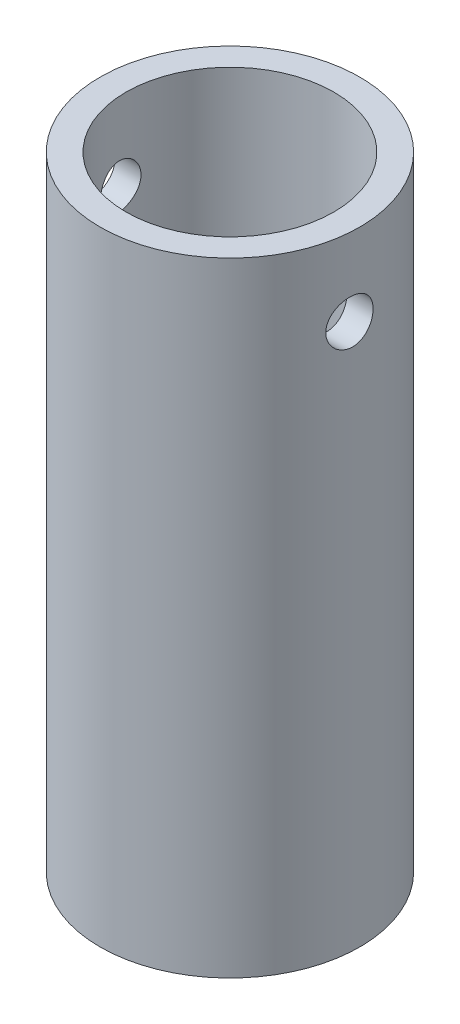
ISO-10303-21;
HEADER;
FILE_DESCRIPTION(('STEP AP214'),'2;1');
FILE_NAME('part.step','',(''),(''),'','','');
FILE_SCHEMA(('AUTOMOTIVE_DESIGN { 1 0 10303 214 1 1 1 1 }'));
ENDSEC;
DATA;
#1=APPLICATION_CONTEXT('core data for automotive mechanical design processes');
#2=APPLICATION_PROTOCOL_DEFINITION('international standard','automotive_design',2000,#1);
#3=PRODUCT_CONTEXT('',#1,'mechanical');
#4=PRODUCT('Part','Part','',(#3));
#5=PRODUCT_RELATED_PRODUCT_CATEGORY('part','',(#4));
#6=PRODUCT_DEFINITION_FORMATION('','',#4);
#7=PRODUCT_DEFINITION_CONTEXT('part definition',#1,'design');
#8=PRODUCT_DEFINITION('design','',#6,#7);
#9=PRODUCT_DEFINITION_SHAPE('','',#8);
#10=(LENGTH_UNIT() NAMED_UNIT(*) SI_UNIT(.MILLI.,.METRE.));
#11=(NAMED_UNIT(*) PLANE_ANGLE_UNIT() SI_UNIT($,.RADIAN.));
#12=(NAMED_UNIT(*) SI_UNIT($,.STERADIAN.) SOLID_ANGLE_UNIT());
#13=UNCERTAINTY_MEASURE_WITH_UNIT(LENGTH_MEASURE(1.E-05),#10,'distance_accuracy_value','');
#14=(GEOMETRIC_REPRESENTATION_CONTEXT(3) GLOBAL_UNCERTAINTY_ASSIGNED_CONTEXT((#13)) GLOBAL_UNIT_ASSIGNED_CONTEXT((#10,
#11,#12)) REPRESENTATION_CONTEXT('',''));
#15=CARTESIAN_POINT('',(0.,0.,0.));
#16=DIRECTION('',(0.,0.,1.));
#17=DIRECTION('',(1.,0.,0.));
#18=AXIS2_PLACEMENT_3D('',#15,#16,#17);
#19=CARTESIAN_POINT('',(0.,38.1,0.));
#20=DIRECTION('',(0.,-1.,0.));
#21=DIRECTION('',(0.,0.,-1.));
#22=AXIS2_PLACEMENT_3D('',#19,#20,#21);
#23=CYLINDRICAL_SURFACE('',#22,7.9375);
#24=CARTESIAN_POINT('',(-7.9375,32.0620434446328,0.));
#25=CARTESIAN_POINT('',(-7.93749916854388,32.0901690046642,-0.0707332037721569));
#26=CARTESIAN_POINT('',(-7.93654628277457,32.1242675503956,-0.139136621308723));
#27=CARTESIAN_POINT('',(-7.93319893250026,32.2034362462289,-0.269289439766741));
#28=CARTESIAN_POINT('',(-7.93080304727269,32.2485171830932,-0.331032212136444));
#29=CARTESIAN_POINT('',(-7.9251667454116,32.3483180944583,-0.446043671701426));
#30=CARTESIAN_POINT('',(-7.9219269308447,32.4030311883096,-0.499318356652004));
#31=CARTESIAN_POINT('',(-7.9152445116897,32.520574277642,-0.595955900179821));
#32=CARTESIAN_POINT('',(-7.91180194269821,32.5834028506257,-0.639320492137896));
#33=CARTESIAN_POINT('',(-7.90531169085098,32.7157679459917,-0.715131941817842));
#34=CARTESIAN_POINT('',(-7.90226603240692,32.7853359256277,-0.74752408116307));
#35=CARTESIAN_POINT('',(-7.89710994552861,32.9289584499102,-0.800165719723793));
#36=CARTESIAN_POINT('',(-7.89499951661862,33.0030129922744,-0.820415225116046));
#37=CARTESIAN_POINT('',(-7.89206943678914,33.1532942300001,-0.848140691763512));
#38=CARTESIAN_POINT('',(-7.89124630673045,33.2295145017414,-0.855651087250744));
#39=CARTESIAN_POINT('',(-7.89101498438398,33.3821359215772,-0.857782176846265));
#40=CARTESIAN_POINT('',(-7.89160675621756,33.4585370650361,-0.852403197799189));
#41=CARTESIAN_POINT('',(-7.89410254448084,33.6090047957604,-0.828967344277877));
#42=CARTESIAN_POINT('',(-7.89600085702248,33.6830800728933,-0.810965570005695));
#43=CARTESIAN_POINT('',(-7.90079252410001,33.8271590418172,-0.762865387311947));
#44=CARTESIAN_POINT('',(-7.90368590853065,33.8971626112089,-0.732766615457998));
#45=CARTESIAN_POINT('',(-7.90999418794165,34.0313815961485,-0.661201383560169));
#46=CARTESIAN_POINT('',(-7.91341085334088,34.0955761387393,-0.619695937608531));
#47=CARTESIAN_POINT('',(-7.92015498560724,34.2161182436795,-0.526522988831815));
#48=CARTESIAN_POINT('',(-7.92348244964828,34.2724655576486,-0.474855164471954));
#49=CARTESIAN_POINT('',(-7.9294143733758,34.3759344273578,-0.362573824867322));
#50=CARTESIAN_POINT('',(-7.93201599216555,34.4230195253824,-0.301926543126087));
#51=CARTESIAN_POINT('',(-7.93586191801818,34.5063374892884,-0.173547568578752));
#52=CARTESIAN_POINT('',(-7.9371062926291,34.5425708951772,-0.105816228519581));
#53=CARTESIAN_POINT('',(-7.93773287547375,34.6029462601578,0.034355536150099));
#54=CARTESIAN_POINT('',(-7.93712641154366,34.6271607229605,0.106764670328491));
#55=CARTESIAN_POINT('',(-7.93376101478138,34.663135702862,0.254562469789466));
#56=CARTESIAN_POINT('',(-7.93100222247633,34.674897032917,0.329950940243872));
#57=CARTESIAN_POINT('',(-7.92327680975247,34.6856229527401,0.480889213758865));
#58=CARTESIAN_POINT('',(-7.91832858979807,34.6846923045515,0.556432555874925));
#59=CARTESIAN_POINT('',(-7.90638232781787,34.6703868447929,0.706163727221364));
#60=CARTESIAN_POINT('',(-7.89938422290508,34.6570116514179,0.78035151479144));
#61=CARTESIAN_POINT('',(-7.88367118860505,34.6181609437016,0.925751380065584));
#62=CARTESIAN_POINT('',(-7.87494668541738,34.5926167806455,0.996944050210173));
#63=CARTESIAN_POINT('',(-7.85638141737859,34.5301701299191,1.13400435937443));
#64=CARTESIAN_POINT('',(-7.84654052423909,34.4932663360363,1.19987138491264));
#65=CARTESIAN_POINT('',(-7.82628257821505,34.4083839461822,1.32564685148368));
#66=CARTESIAN_POINT('',(-7.81585848552863,34.3602240706286,1.38543188100612));
#67=CARTESIAN_POINT('',(-7.79543238038634,34.254495592552,1.4960993963362));
#68=CARTESIAN_POINT('',(-7.78543039613535,34.1969263625533,1.54698128795714));
#69=CARTESIAN_POINT('',(-7.76664377122831,34.0735111762601,1.63870768991843));
#70=CARTESIAN_POINT('',(-7.75786731290255,34.0076147098128,1.67948602268849));
#71=CARTESIAN_POINT('',(-7.74241701445269,33.8696560088021,1.74933458759098));
#72=CARTESIAN_POINT('',(-7.73574290513512,33.7975945651317,1.77840631881803));
#73=CARTESIAN_POINT('',(-7.72524183943394,33.6507300241767,1.82347870915689));
#74=CARTESIAN_POINT('',(-7.72136545113064,33.5760003334144,1.83970682236677));
#75=CARTESIAN_POINT('',(-7.71664489820427,33.4247883308532,1.85940948762514));
#76=CARTESIAN_POINT('',(-7.7158002547242,33.3483062977534,1.86288605375255));
#77=CARTESIAN_POINT('',(-7.71720972566059,33.1975918314706,1.85703707219386));
#78=CARTESIAN_POINT('',(-7.71939466369135,33.1233474554488,1.84799732425937));
#79=CARTESIAN_POINT('',(-7.72653217650053,32.9774713148849,1.81792262321188));
#80=CARTESIAN_POINT('',(-7.7314847881102,32.9058395851245,1.79688751046863));
#81=CARTESIAN_POINT('',(-7.74371513911773,32.7669941663969,1.74342493227445));
#82=CARTESIAN_POINT('',(-7.75099815509986,32.6997909250732,1.71097159651296));
#83=CARTESIAN_POINT('',(-7.76724372572776,32.5717324322624,1.63563772190565));
#84=CARTESIAN_POINT('',(-7.77620650335549,32.5108780252304,1.59275579847927));
#85=CARTESIAN_POINT('',(-7.7952896250567,32.3956943275706,1.49660244552139));
#86=CARTESIAN_POINT('',(-7.80543245667906,32.3415549900359,1.44310787193867));
#87=CARTESIAN_POINT('',(-7.8258613221016,32.2429517250058,1.32786304144477));
#88=CARTESIAN_POINT('',(-7.8361473671141,32.1984885596515,1.26611213484384));
#89=CARTESIAN_POINT('',(-7.85622300417939,32.1198204892148,1.13495804242506));
#90=CARTESIAN_POINT('',(-7.86600226686983,32.0857875934762,1.06544993928901));
#91=CARTESIAN_POINT('',(-7.88416205948236,32.0299503563448,0.921494622470553));
#92=CARTESIAN_POINT('',(-7.89254241127106,32.0081475714669,0.847046781459967));
#93=CARTESIAN_POINT('',(-7.90729134764726,31.9776176773046,0.695962799897215));
#94=CARTESIAN_POINT('',(-7.91367576991006,31.9687854602011,0.619349436125455));
#95=CARTESIAN_POINT('',(-7.92420428277064,31.9642182031312,0.46563004048267));
#96=CARTESIAN_POINT('',(-7.92835066746636,31.9684697216139,0.388524595391372));
#97=CARTESIAN_POINT('',(-7.93345816204108,31.9867406896569,0.258892816849828));
#98=CARTESIAN_POINT('',(-7.93500066738084,31.9974648439074,0.20590119147878));
#99=CARTESIAN_POINT('',(-7.93702187328106,32.0251381873278,0.10154875441405));
#100=CARTESIAN_POINT('',(-7.93750058994997,32.0420872822318,0.0501879180377061));
#101=CARTESIAN_POINT('',(-7.9375,32.0620434446328,0.));
#102=B_SPLINE_CURVE_WITH_KNOTS('',3,(#24,#25,#26,#27,#28,#29,#30,#31,#32,#33,#34,#35,#36,#37,
#38,#39,#40,#41,#42,#43,#44,#45,#46,#47,#48,#49,#50,#51,#52,#53,#54,#55,#56,#57,#58,#59,#60,#61,
#62,#63,#64,#65,#66,#67,#68,#69,#70,#71,#72,#73,#74,#75,#76,#77,#78,#79,#80,#81,#82,#83,#84,#85,
#86,#87,#88,#89,#90,#91,#92,#93,#94,#95,#96,#97,#98,#99,#100,#101),.UNSPECIFIED.,.T.,.F.,(4,2,2,
2,2,2,2,2,2,2,2,2,2,2,2,2,2,2,2,2,2,2,2,2,2,2,2,2,2,2,2,2,2,2,2,2,2,2,4),(0.,0.228161678927608,
0.456548365258595,0.684772562635524,0.91295681056398,1.14226278812989,1.37156864905155,
1.60025369511128,1.82893294231017,2.05662013816189,2.28431417497443,2.51279631956475,
2.74128569442881,2.97065719760266,3.20001728477682,3.42797642207864,3.65592067700165,
3.88198458279072,4.10805542456309,4.33541697886789,4.56280468661985,4.79414315838968,
5.02549706357827,5.2583284779152,5.4911300674223,5.7197103567987,5.94825454086392,
6.17166529662205,6.39507902552401,6.61900223849998,6.8429551975126,7.07224263264999,
7.30154812101556,7.53445360583085,7.76738872559169,7.9984256208273,8.22922524001537,
8.39111714411399,8.55300659674291),.UNSPECIFIED.);
#103=CARTESIAN_POINT('',(-7.9375,32.0620434446328,0.));
#104=VERTEX_POINT('',#103);
#105=EDGE_CURVE('E88',#104,#104,#102,.T.);
#106=ORIENTED_EDGE('',*,*,#105,.T.);
#107=EDGE_LOOP('',(#106));
#108=FACE_BOUND('',#107,.T.);
#109=CARTESIAN_POINT('',(7.89111626104953,33.3248,-0.856849114255138));
#110=CARTESIAN_POINT('',(7.89111744475563,33.2486549165749,-0.856846163996183));
#111=CARTESIAN_POINT('',(7.89182160919894,33.1724692184582,-0.850428354531421));
#112=CARTESIAN_POINT('',(7.89452709820867,33.0222241706318,-0.824928182926496));
#113=CARTESIAN_POINT('',(7.89652959035466,32.9481667975791,-0.805834420995585));
#114=CARTESIAN_POINT('',(7.90149928900082,32.8043610556772,-0.755545907915396));
#115=CARTESIAN_POINT('',(7.90446593490283,32.7346102108146,-0.724358186654592));
#116=CARTESIAN_POINT('',(7.91086330532944,32.6013357455797,-0.650773089193705));
#117=CARTESIAN_POINT('',(7.91429396528751,32.5378112609403,-0.608377271793462));
#118=CARTESIAN_POINT('',(7.92102438554991,32.4185075125833,-0.513370342890361));
#119=CARTESIAN_POINT('',(7.92432358390387,32.3627593828252,-0.460720082894937));
#120=CARTESIAN_POINT('',(7.93012593112444,32.2608748313727,-0.346779502082859));
#121=CARTESIAN_POINT('',(7.93262907011091,32.2147385289762,-0.285489074044011));
#122=CARTESIAN_POINT('',(7.93622867694035,32.1334516570597,-0.156074993426871));
#123=CARTESIAN_POINT('',(7.93732686241042,32.0982877131371,-0.0879597946034226));
#124=CARTESIAN_POINT('',(7.93763510370667,32.039893682106,0.0532095882749936));
#125=CARTESIAN_POINT('',(7.93684530164243,32.0166626969589,0.126263400196419));
#126=CARTESIAN_POINT('',(7.93309587922839,31.9829577232854,0.274476475224678));
#127=CARTESIAN_POINT('',(7.9301567772212,31.9723655769589,0.349609408789579));
#128=CARTESIAN_POINT('',(7.92206675077304,31.9638023140704,0.500469539651902));
#129=CARTESIAN_POINT('',(7.91691587386939,31.9658309262651,0.576196724142843));
#130=CARTESIAN_POINT('',(7.90458955440573,31.9823611181511,0.725951883198919));
#131=CARTESIAN_POINT('',(7.89741809266812,31.9968382864556,0.79998289242206));
#132=CARTESIAN_POINT('',(7.88144365572102,32.0377466299135,0.944478894627849));
#133=CARTESIAN_POINT('',(7.87264053946463,32.0641788387944,1.01494357865183));
#134=CARTESIAN_POINT('',(7.85385283084989,32.1286675161689,1.15139718555961));
#135=CARTESIAN_POINT('',(7.84385338261927,32.1668820165556,1.21730935631508));
#136=CARTESIAN_POINT('',(7.82351813770478,32.2537371692758,1.34181054058567));
#137=CARTESIAN_POINT('',(7.81318230326625,32.3023789953782,1.4003987284882));
#138=CARTESIAN_POINT('',(7.79284992540241,32.4095783677451,1.50947822461537));
#139=CARTESIAN_POINT('',(7.78286049323546,32.4682697101386,1.55983952748867));
#140=CARTESIAN_POINT('',(7.76425193134638,32.593482517909,1.64997670720218));
#141=CARTESIAN_POINT('',(7.7556327518195,32.6600036985408,1.68975296881374));
#142=CARTESIAN_POINT('',(7.7406167053492,32.7985309362413,1.75725700153467));
#143=CARTESIAN_POINT('',(7.73420401083517,32.8704932116087,1.78507095706263));
#144=CARTESIAN_POINT('',(7.72413337814207,33.0182603245594,1.82815892538772));
#145=CARTESIAN_POINT('',(7.72047493885178,33.0940644604717,1.84343521934182));
#146=CARTESIAN_POINT('',(7.7163299485184,33.2453509355865,1.8607083925131));
#147=CARTESIAN_POINT('',(7.71576717552154,33.3207948517947,1.86302440680382));
#148=CARTESIAN_POINT('',(7.71766280789174,33.4709851322765,1.85515578880033));
#149=CARTESIAN_POINT('',(7.72012099983736,33.5457315454506,1.84497203957419));
#150=CARTESIAN_POINT('',(7.72777783056287,33.6915571908849,1.81262920461486));
#151=CARTESIAN_POINT('',(7.73294574866408,33.7626679185181,1.79060429481457));
#152=CARTESIAN_POINT('',(7.74553084503548,33.900180629287,1.7353547725242));
#153=CARTESIAN_POINT('',(7.75294822816203,33.9665821828836,1.70212913996565));
#154=CARTESIAN_POINT('',(7.76952614528382,34.0940250421276,1.62479354774546));
#155=CARTESIAN_POINT('',(7.77871395785355,34.1549571113724,1.5805095392966));
#156=CARTESIAN_POINT('',(7.79796947390115,34.268615500095,1.48258665040844));
#157=CARTESIAN_POINT('',(7.80803730092068,34.32134066454,1.42894645543637));
#158=CARTESIAN_POINT('',(7.82848202368065,34.4183497735859,1.31238350214929));
#159=CARTESIAN_POINT('',(7.83886067225362,34.4624095958067,1.24927431752029));
#160=CARTESIAN_POINT('',(7.85887835534836,34.5393048251982,1.11644215369815));
#161=CARTESIAN_POINT('',(7.86851737471283,34.5721400023886,1.04671903903047));
#162=CARTESIAN_POINT('',(7.88637407922838,34.6256752414108,0.902388520751261));
#163=CARTESIAN_POINT('',(7.89458831506082,34.6463461356206,0.827769850419089));
#164=CARTESIAN_POINT('',(7.90903573794771,34.6747414136211,0.67592286836617));
#165=CARTESIAN_POINT('',(7.91526913691593,34.6824671826846,0.59869483677858));
#166=CARTESIAN_POINT('',(7.92537369639136,34.6846421661336,0.445173548514917));
#167=CARTESIAN_POINT('',(7.92928198236219,34.6793074080158,0.368885778244611));
#168=CARTESIAN_POINT('',(7.93485834850581,34.6559097218641,0.218205835315318));
#169=CARTESIAN_POINT('',(7.93652657193037,34.6378476078561,0.143813541739296));
#170=CARTESIAN_POINT('',(7.93782286854246,34.589771067571,-9.3806753176742E-05));
#171=CARTESIAN_POINT('',(7.93747345670301,34.5598919990184,-0.0696539535747916));
#172=CARTESIAN_POINT('',(7.93518776051005,34.4890307982777,-0.202836204401613));
#173=CARTESIAN_POINT('',(7.93325146757536,34.4480486060494,-0.266458276294172));
#174=CARTESIAN_POINT('',(7.92832243655451,34.3559048705421,-0.386303882497495));
#175=CARTESIAN_POINT('',(7.92532448379326,34.3046936354046,-0.442488981854111));
#176=CARTESIAN_POINT('',(7.91889843266426,34.1936366575814,-0.545552098954591));
#177=CARTESIAN_POINT('',(7.91547023497225,34.1337889206349,-0.592427961139243));
#178=CARTESIAN_POINT('',(7.90877902561736,34.0065534256608,-0.675941297852719));
#179=CARTESIAN_POINT('',(7.90551776887485,33.9391029242089,-0.712483291131605));
#180=CARTESIAN_POINT('',(7.89976245774663,33.7990351489136,-0.773700406498393));
#181=CARTESIAN_POINT('',(7.89726770425672,33.7264226580571,-0.798386353768201));
#182=CARTESIAN_POINT('',(7.89398727287437,33.5987788525212,-0.830086194933556));
#183=CARTESIAN_POINT('',(7.8929191401643,33.544481449339,-0.840106762982627));
#184=CARTESIAN_POINT('',(7.89148320837642,33.4350631262982,-0.853489264949914));
#185=CARTESIAN_POINT('',(7.89111540384153,33.3799422128598,-0.856851250752992));
#186=CARTESIAN_POINT('',(7.89111626104953,33.3248,-0.856849114255138));
#187=B_SPLINE_CURVE_WITH_KNOTS('',3,(#109,#110,#111,#112,#113,#114,#115,#116,#117,#118,#119,
#120,#121,#122,#123,#124,#125,#126,#127,#128,#129,#130,#131,#132,#133,#134,#135,#136,#137,#138,
#139,#140,#141,#142,#143,#144,#145,#146,#147,#148,#149,#150,#151,#152,#153,#154,#155,#156,#157,
#158,#159,#160,#161,#162,#163,#164,#165,#166,#167,#168,#169,#170,#171,#172,#173,#174,#175,#176,
#177,#178,#179,#180,#181,#182,#183,#184,#185,#186),.UNSPECIFIED.,.T.,.F.,(4,2,2,2,2,2,2,2,2,2,2,
2,2,2,2,2,2,2,2,2,2,2,2,2,2,2,2,2,2,2,2,2,2,2,2,2,2,2,4),(0.,0.22823488189645,0.45667529950032,
0.684983129488192,0.913259223563788,1.14242452484649,1.37159267026022,1.60048037739219,
1.8293508565991,2.05606447807743,2.28277322708011,2.50903841568205,2.7353231727039,
2.96478575057414,3.19427417185306,3.42709679054718,3.6599109448707,3.89101844721157,
4.12208389151514,4.34743365353527,4.57276749623619,4.79560022639934,5.01845325579539,
5.24506321608832,5.47170504048744,5.7036030251858,5.93550576092573,6.16796231289474,
6.40039398783209,6.62900718096418,6.85760575360917,7.08365834015683,7.30971214910848,
7.53689205455686,7.76412450246616,7.99339258446324,8.22245093301684,8.38773375814642,
8.55301529535764),.UNSPECIFIED.);
#188=CARTESIAN_POINT('',(7.89111626104953,33.3248,-0.856849114255138));
#189=VERTEX_POINT('',#188);
#190=EDGE_CURVE('E82',#189,#189,#187,.T.);
#191=ORIENTED_EDGE('',*,*,#190,.T.);
#192=EDGE_LOOP('',(#191));
#193=FACE_BOUND('',#192,.T.);
#194=CARTESIAN_POINT('',(0.,38.1,0.));
#195=DIRECTION('',(0.,1.,0.));
#196=DIRECTION('',(0.,0.,1.));
#197=AXIS2_PLACEMENT_3D('',#194,#195,#196);
#198=CIRCLE('',#197,7.9375);
#199=CARTESIAN_POINT('',(0.,38.1,7.9375));
#200=VERTEX_POINT('',#199);
#201=EDGE_CURVE('E10',#200,#200,#198,.T.);
#202=ORIENTED_EDGE('',*,*,#201,.F.);
#203=EDGE_LOOP('',(#202));
#204=FACE_BOUND('',#203,.T.);
#205=CARTESIAN_POINT('',(0.,0.,0.));
#206=DIRECTION('',(0.,1.,0.));
#207=DIRECTION('',(0.,0.,1.));
#208=AXIS2_PLACEMENT_3D('',#205,#206,#207);
#209=CIRCLE('',#208,7.9375);
#210=CARTESIAN_POINT('',(0.,0.,7.9375));
#211=VERTEX_POINT('',#210);
#212=EDGE_CURVE('E50',#211,#211,#209,.T.);
#213=ORIENTED_EDGE('',*,*,#212,.T.);
#214=EDGE_LOOP('',(#213));
#215=FACE_BOUND('',#214,.T.);
#216=ADVANCED_FACE('F36',(#108,#193,#204,#215),#23,.T.);
#217=CARTESIAN_POINT('',(0.,38.1,0.));
#218=DIRECTION('',(0.,1.,0.));
#219=DIRECTION('',(0.,0.,1.));
#220=AXIS2_PLACEMENT_3D('',#217,#218,#219);
#221=PLANE('',#220);
#222=CARTESIAN_POINT('',(0.,38.1,0.));
#223=DIRECTION('',(0.,1.,0.));
#224=DIRECTION('',(0.,0.,1.));
#225=AXIS2_PLACEMENT_3D('',#222,#223,#224);
#226=CIRCLE('',#225,6.35);
#227=CARTESIAN_POINT('',(0.,38.1,6.35));
#228=VERTEX_POINT('',#227);
#229=EDGE_CURVE('E59',#228,#228,#226,.T.);
#230=ORIENTED_EDGE('',*,*,#229,.F.);
#231=EDGE_LOOP('',(#230));
#232=FACE_BOUND('',#231,.T.);
#233=ORIENTED_EDGE('',*,*,#201,.T.);
#234=EDGE_LOOP('',(#233));
#235=FACE_BOUND('',#234,.T.);
#236=ADVANCED_FACE('F103',(#232,#235),#221,.T.);
#237=CARTESIAN_POINT('',(0.,0.,0.));
#238=DIRECTION('',(0.,1.,0.));
#239=DIRECTION('',(0.,0.,1.));
#240=AXIS2_PLACEMENT_3D('',#237,#238,#239);
#241=PLANE('',#240);
#242=ORIENTED_EDGE('',*,*,#212,.F.);
#243=EDGE_LOOP('',(#242));
#244=FACE_BOUND('',#243,.T.);
#245=ADVANCED_FACE('F105',(#244),#241,.F.);
#246=CARTESIAN_POINT('',(0.,19.05,0.));
#247=DIRECTION('',(0.,1.,0.));
#248=DIRECTION('',(0.,0.,1.));
#249=AXIS2_PLACEMENT_3D('',#246,#247,#248);
#250=CYLINDRICAL_SURFACE('',#249,6.35);
#251=CARTESIAN_POINT('',(-6.29192415683789,33.3248,-0.856849114255138));
#252=CARTESIAN_POINT('',(-6.29192544359369,33.2487592380106,-0.856846546093186));
#253=CARTESIAN_POINT('',(-6.29280629103866,33.1726861350022,-0.850446433618049));
#254=CARTESIAN_POINT('',(-6.2961888501394,33.0226789820071,-0.825024059395809));
#255=CARTESIAN_POINT('',(-6.29869174567662,32.9487465356246,-0.80599257816815));
#256=CARTESIAN_POINT('',(-6.30490112275527,32.8051911032015,-0.755880275823284));
#257=CARTESIAN_POINT('',(-6.30860683478817,32.7355653957168,-0.724807155953197));
#258=CARTESIAN_POINT('',(-6.31659741050685,32.6025101323865,-0.65149868460312));
#259=CARTESIAN_POINT('',(-6.32088222811105,32.5390800842204,-0.609264221017598));
#260=CARTESIAN_POINT('',(-6.3293007673724,32.4197870532217,-0.514510750213866));
#261=CARTESIAN_POINT('',(-6.33343342016304,32.3639720866178,-0.461931168505745));
#262=CARTESIAN_POINT('',(-6.3407072241428,32.2619333667782,-0.348105208560699));
#263=CARTESIAN_POINT('',(-6.34384837692838,32.2157095980992,-0.286858844278748));
#264=CARTESIAN_POINT('',(-6.34837408780668,32.1342627460216,-0.157538437391111));
#265=CARTESIAN_POINT('',(-6.34976191435839,32.0990192864223,-0.0894773549229838));
#266=CARTESIAN_POINT('',(-6.35018160127973,32.0404579890593,0.0515998808486047));
#267=CARTESIAN_POINT('',(-6.3492137364522,32.0171387606602,0.124615455220587));
#268=CARTESIAN_POINT('',(-6.34458070256346,31.9833430436817,0.272353013358708));
#269=CARTESIAN_POINT('',(-6.34095508390218,31.9726841849322,0.347034571011779));
#270=CARTESIAN_POINT('',(-6.33097042001397,31.9638367162242,0.496946485237333));
#271=CARTESIAN_POINT('',(-6.32461145818096,31.9656477258371,0.572176824997721));
#272=CARTESIAN_POINT('',(-6.30939666590795,31.9815501963709,0.720819214789309));
#273=CARTESIAN_POINT('',(-6.30054875094689,31.9956030176962,0.7942362391997));
#274=CARTESIAN_POINT('',(-6.28082528102292,32.0354218482935,0.937533800166652));
#275=CARTESIAN_POINT('',(-6.26994947646546,32.0611892999752,1.00741390004764));
#276=CARTESIAN_POINT('',(-6.24661579953283,32.1243274411565,1.14330597283395));
#277=CARTESIAN_POINT('',(-6.23412897765507,32.1619353351042,1.20920271076187));
#278=CARTESIAN_POINT('',(-6.20866866311643,32.2475158576228,1.33378507405307));
#279=CARTESIAN_POINT('',(-6.19569508258947,32.2954903650091,1.39246938922903));
#280=CARTESIAN_POINT('',(-6.16997422997376,32.4018118320298,1.50239232740176));
#281=CARTESIAN_POINT('',(-6.15723926169027,32.4603743033652,1.55342575870094));
#282=CARTESIAN_POINT('',(-6.13343267949581,32.585557288497,1.64491494163357));
#283=CARTESIAN_POINT('',(-6.12236099235263,32.65217744729,1.68537115902674));
#284=CARTESIAN_POINT('',(-6.10303058337326,32.7909701242831,1.75407659033564));
#285=CARTESIAN_POINT('',(-6.09474436121443,32.8630791841596,1.7824459305373));
#286=CARTESIAN_POINT('',(-6.08166855421715,33.0113570379056,1.82656619642474));
#287=CARTESIAN_POINT('',(-6.07687789591981,33.0875245777328,1.84232099607686));
#288=CARTESIAN_POINT('',(-6.07141033581603,33.2385554869842,1.86025826590905));
#289=CARTESIAN_POINT('',(-6.07057988291362,33.3133533698994,1.86294741792237));
#290=CARTESIAN_POINT('',(-6.07269876913842,33.462317827663,1.85602873250867));
#291=CARTESIAN_POINT('',(-6.07564770079528,33.5364844697002,1.8464222207258));
#292=CARTESIAN_POINT('',(-6.08494033077059,33.6806724765991,1.81555798357889));
#293=CARTESIAN_POINT('',(-6.09122015717003,33.7507451693117,1.79451929725821));
#294=CARTESIAN_POINT('',(-6.10655139387578,33.88635660309,1.74163245202052));
#295=CARTESIAN_POINT('',(-6.11560316979258,33.9518947446653,1.7097828671235));
#296=CARTESIAN_POINT('',(-6.13595798882475,34.0784581412976,1.63525074756032));
#297=CARTESIAN_POINT('',(-6.14731356579958,34.1393212236101,1.59230746844267));
#298=CARTESIAN_POINT('',(-6.17116371538713,34.2531151700718,1.497209884161));
#299=CARTESIAN_POINT('',(-6.18365853391076,34.3060443150913,1.44505358803355));
#300=CARTESIAN_POINT('',(-6.20927789511376,34.404499188645,1.33075813613944));
#301=CARTESIAN_POINT('',(-6.2224085945582,34.449677093423,1.26832024034862));
#302=CARTESIAN_POINT('',(-6.24781358705519,34.5289125120424,1.13658282243087));
#303=CARTESIAN_POINT('',(-6.26008784064758,34.5629695137616,1.06728298450004));
#304=CARTESIAN_POINT('',(-6.28294320100801,34.6190829947404,0.923287880564558));
#305=CARTESIAN_POINT('',(-6.29351525276601,34.6410767017827,0.848566641001303));
#306=CARTESIAN_POINT('',(-6.31218920793385,34.6720077570068,0.696171217667073));
#307=CARTESIAN_POINT('',(-6.32029153518239,34.6809473464539,0.618497543150742));
#308=CARTESIAN_POINT('',(-6.33344871487459,34.6853082726883,0.46448974871818));
#309=CARTESIAN_POINT('',(-6.33857522921401,34.6810646460841,0.388171208487946));
#310=CARTESIAN_POINT('',(-6.34601848275998,34.6598168128731,0.237194574470082));
#311=CARTESIAN_POINT('',(-6.34833551830722,34.6428139524024,0.16253630637442));
#312=CARTESIAN_POINT('',(-6.35037511788839,34.596938703195,0.0184324632807324));
#313=CARTESIAN_POINT('',(-6.35014421326098,34.568288367219,-0.0510833318316584));
#314=CARTESIAN_POINT('',(-6.34767209915825,34.4999519272981,-0.184418045172108));
#315=CARTESIAN_POINT('',(-6.34543084543583,34.4602655804678,-0.248236837977092));
#316=CARTESIAN_POINT('',(-6.33956857788635,34.370664542328,-0.368844911125401));
#317=CARTESIAN_POINT('',(-6.33593820103762,34.3206815282242,-0.425582946154558));
#318=CARTESIAN_POINT('',(-6.32806101111528,34.2120284041609,-0.529992251368887));
#319=CARTESIAN_POINT('',(-6.32381405916616,34.1533563370455,-0.577661473318537));
#320=CARTESIAN_POINT('',(-6.3154178628116,34.0280510092776,-0.66323213046452));
#321=CARTESIAN_POINT('',(-6.31127082383824,33.9613176422907,-0.700987210959653));
#322=CARTESIAN_POINT('',(-6.30386363647445,33.8224504711353,-0.764748975860274));
#323=CARTESIAN_POINT('',(-6.30060282847529,33.7503207346811,-0.79076440749076));
#324=CARTESIAN_POINT('',(-6.296081528449,33.6192600166119,-0.82588836327033));
#325=CARTESIAN_POINT('',(-6.29453660582704,33.5609907789595,-0.837478432451578));
#326=CARTESIAN_POINT('',(-6.29245742734278,33.4434209089407,-0.852959739375778));
#327=CARTESIAN_POINT('',(-6.29192315302451,33.3841202954287,-0.856851117708572));
#328=CARTESIAN_POINT('',(-6.29192415683789,33.3248,-0.856849114255138));
#329=B_SPLINE_CURVE_WITH_KNOTS('',3,(#251,#252,#253,#254,#255,#256,#257,#258,#259,#260,#261,
#262,#263,#264,#265,#266,#267,#268,#269,#270,#271,#272,#273,#274,#275,#276,#277,#278,#279,#280,
#281,#282,#283,#284,#285,#286,#287,#288,#289,#290,#291,#292,#293,#294,#295,#296,#297,#298,#299,
#300,#301,#302,#303,#304,#305,#306,#307,#308,#309,#310,#311,#312,#313,#314,#315,#316,#317,#318,
#319,#320,#321,#322,#323,#324,#325,#326,#327,#328),.UNSPECIFIED.,.T.,.F.,(4,2,2,2,2,2,2,2,2,2,2,
2,2,2,2,2,2,2,2,2,2,2,2,2,2,2,2,2,2,2,2,2,2,2,2,2,2,2,4),(0.,0.227907157088483,
0.455980844007674,0.683908906164838,0.911818841904365,1.14110527501129,1.3703913389328,
1.59924934603753,1.82808065702406,2.05357409969167,2.27906066307552,2.50383807739246,
2.7286431758086,2.95827399845009,3.18794647368204,3.4229668868155,3.65797694925634,
3.89059354466888,4.1231386753404,4.34658959829358,4.57001643214803,4.78930607787832,
5.00862465961594,5.23366029954971,5.45874463005726,5.69218564328906,5.92563740506345,
6.16029269557854,6.39490769331642,6.62360943009368,6.85228704156686,7.07679548207822,
7.3013088640652,7.5273629637019,7.753468058301,7.98274396993574,8.21184876461954,
8.38964507319069,8.56743813489996),.UNSPECIFIED.);
#330=CARTESIAN_POINT('',(-6.29192415683789,33.3248,-0.856849114255138));
#331=VERTEX_POINT('',#330);
#332=EDGE_CURVE('E40',#331,#331,#329,.T.);
#333=ORIENTED_EDGE('',*,*,#332,.T.);
#334=EDGE_LOOP('',(#333));
#335=FACE_BOUND('',#334,.T.);
#336=CARTESIAN_POINT('',(6.29192415683789,33.3248,-0.856849114255138));
#337=CARTESIAN_POINT('',(6.29192544359369,33.4008407619894,-0.856846546093186));
#338=CARTESIAN_POINT('',(6.29280629103867,33.4769138649978,-0.850446433618049));
#339=CARTESIAN_POINT('',(6.2961888501394,33.6269210179929,-0.825024059395809));
#340=CARTESIAN_POINT('',(6.29869174567662,33.7008534643754,-0.80599257816815));
#341=CARTESIAN_POINT('',(6.30490112275527,33.8444088967985,-0.755880275823284));
#342=CARTESIAN_POINT('',(6.30860683478817,33.9140346042832,-0.724807155953195));
#343=CARTESIAN_POINT('',(6.31659741050685,34.0470898676135,-0.651498684603118));
#344=CARTESIAN_POINT('',(6.32088222811105,34.1105199157796,-0.609264221017597));
#345=CARTESIAN_POINT('',(6.3293007673724,34.2298129467783,-0.514510750213865));
#346=CARTESIAN_POINT('',(6.33343342016304,34.2856279133822,-0.461931168505742));
#347=CARTESIAN_POINT('',(6.3407072241428,34.3876666332218,-0.348105208560697));
#348=CARTESIAN_POINT('',(6.34384837692838,34.4338904019008,-0.286858844278747));
#349=CARTESIAN_POINT('',(6.34837408780668,34.5153372539784,-0.157538437391111));
#350=CARTESIAN_POINT('',(6.34976191435839,34.5505807135777,-0.0894773549229839));
#351=CARTESIAN_POINT('',(6.35018160127973,34.6091420109407,0.0515998808486047));
#352=CARTESIAN_POINT('',(6.3492137364522,34.6324612393398,0.124615455220587));
#353=CARTESIAN_POINT('',(6.34458070256346,34.6662569563183,0.272353013358708));
#354=CARTESIAN_POINT('',(6.34095508390218,34.6769158150678,0.347034571011779));
#355=CARTESIAN_POINT('',(6.33097042001397,34.6857632837758,0.496946485237333));
#356=CARTESIAN_POINT('',(6.32461145818096,34.6839522741629,0.572176824997721));
#357=CARTESIAN_POINT('',(6.30939666590795,34.6680498036291,0.720819214789309));
#358=CARTESIAN_POINT('',(6.30054875094689,34.6539969823038,0.7942362391997));
#359=CARTESIAN_POINT('',(6.28082528102292,34.6141781517065,0.937533800166652));
#360=CARTESIAN_POINT('',(6.26994947646546,34.5884107000248,1.00741390004764));
#361=CARTESIAN_POINT('',(6.24661579953283,34.5252725588435,1.14330597283395));
#362=CARTESIAN_POINT('',(6.23412897765507,34.4876646648958,1.20920271076187));
#363=CARTESIAN_POINT('',(6.20866866311643,34.4020841423772,1.33378507405307));
#364=CARTESIAN_POINT('',(6.19569508258947,34.3541096349909,1.39246938922903));
#365=CARTESIAN_POINT('',(6.16997422997376,34.2477881679702,1.50239232740176));
#366=CARTESIAN_POINT('',(6.15723926169027,34.1892256966348,1.55342575870094));
#367=CARTESIAN_POINT('',(6.13343267949581,34.064042711503,1.64491494163357));
#368=CARTESIAN_POINT('',(6.12236099235263,33.99742255271,1.68537115902674));
#369=CARTESIAN_POINT('',(6.10303058337326,33.8586298757169,1.75407659033564));
#370=CARTESIAN_POINT('',(6.09474436121443,33.7865208158404,1.7824459305373));
#371=CARTESIAN_POINT('',(6.08166855421715,33.6382429620945,1.82656619642474));
#372=CARTESIAN_POINT('',(6.07687789591981,33.5620754222672,1.84232099607686));
#373=CARTESIAN_POINT('',(6.07141033581603,33.4110445130158,1.86025826590905));
#374=CARTESIAN_POINT('',(6.07057988291362,33.3362466301006,1.86294741792237));
#375=CARTESIAN_POINT('',(6.07269876913842,33.187282172337,1.85602873250867));
#376=CARTESIAN_POINT('',(6.07564770079528,33.1131155302998,1.8464222207258));
#377=CARTESIAN_POINT('',(6.08494033077059,32.9689275234009,1.81555798357889));
#378=CARTESIAN_POINT('',(6.09122015717003,32.8988548306883,1.79451929725821));
#379=CARTESIAN_POINT('',(6.10655139387578,32.76324339691,1.74163245202052));
#380=CARTESIAN_POINT('',(6.11560316979258,32.6977052553347,1.7097828671235));
#381=CARTESIAN_POINT('',(6.13595798882475,32.5711418587024,1.63525074756032));
#382=CARTESIAN_POINT('',(6.14731356579958,32.5102787763899,1.59230746844266));
#383=CARTESIAN_POINT('',(6.17116371538713,32.3964848299282,1.497209884161));
#384=CARTESIAN_POINT('',(6.18365853391076,32.3435556849087,1.44505358803355));
#385=CARTESIAN_POINT('',(6.20927789511376,32.245100811355,1.33075813613944));
#386=CARTESIAN_POINT('',(6.2224085945582,32.199922906577,1.26832024034862));
#387=CARTESIAN_POINT('',(6.24781358705519,32.1206874879576,1.13658282243087));
#388=CARTESIAN_POINT('',(6.26008784064758,32.0866304862384,1.06728298450004));
#389=CARTESIAN_POINT('',(6.28294320100801,32.0305170052596,0.923287880564558));
#390=CARTESIAN_POINT('',(6.29351525276601,32.0085232982173,0.848566641001303));
#391=CARTESIAN_POINT('',(6.31218920793385,31.9775922429932,0.696171217667073));
#392=CARTESIAN_POINT('',(6.32029153518239,31.9686526535461,0.618497543150742));
#393=CARTESIAN_POINT('',(6.33344871487459,31.9642917273117,0.46448974871818));
#394=CARTESIAN_POINT('',(6.33857522921401,31.9685353539159,0.388171208487946));
#395=CARTESIAN_POINT('',(6.34601848275998,31.9897831871269,0.237194574470083));
#396=CARTESIAN_POINT('',(6.34833551830722,32.0067860475976,0.162536306374421));
#397=CARTESIAN_POINT('',(6.35037511788839,32.052661296805,0.0184324632807348));
#398=CARTESIAN_POINT('',(6.35014421326098,32.081311632781,-0.0510833318316547));
#399=CARTESIAN_POINT('',(6.34767209915825,32.1496480727019,-0.184418045172105));
#400=CARTESIAN_POINT('',(6.34543084543583,32.1893344195322,-0.24823683797709));
#401=CARTESIAN_POINT('',(6.33956857788635,32.278935457672,-0.368844911125401));
#402=CARTESIAN_POINT('',(6.33593820103762,32.3289184717758,-0.425582946154558));
#403=CARTESIAN_POINT('',(6.32806101111528,32.4375715958391,-0.529992251368887));
#404=CARTESIAN_POINT('',(6.32381405916616,32.4962436629545,-0.577661473318537));
#405=CARTESIAN_POINT('',(6.3154178628116,32.6215489907224,-0.663232130464518));
#406=CARTESIAN_POINT('',(6.31127082383824,32.6882823577093,-0.70098721095965));
#407=CARTESIAN_POINT('',(6.30386363647445,32.8271495288647,-0.764748975860273));
#408=CARTESIAN_POINT('',(6.30060282847529,32.8992792653189,-0.79076440749076));
#409=CARTESIAN_POINT('',(6.296081528449,33.0303399833881,-0.82588836327033));
#410=CARTESIAN_POINT('',(6.29453660582704,33.0886092210405,-0.837478432451578));
#411=CARTESIAN_POINT('',(6.29245742734279,33.2061790910593,-0.852959739375778));
#412=CARTESIAN_POINT('',(6.29192315302451,33.2654797045713,-0.856851117708572));
#413=CARTESIAN_POINT('',(6.29192415683789,33.3248,-0.856849114255138));
#414=B_SPLINE_CURVE_WITH_KNOTS('',3,(#336,#337,#338,#339,#340,#341,#342,#343,#344,#345,#346,
#347,#348,#349,#350,#351,#352,#353,#354,#355,#356,#357,#358,#359,#360,#361,#362,#363,#364,#365,
#366,#367,#368,#369,#370,#371,#372,#373,#374,#375,#376,#377,#378,#379,#380,#381,#382,#383,#384,
#385,#386,#387,#388,#389,#390,#391,#392,#393,#394,#395,#396,#397,#398,#399,#400,#401,#402,#403,
#404,#405,#406,#407,#408,#409,#410,#411,#412,#413),.UNSPECIFIED.,.T.,.F.,(4,2,2,2,2,2,2,2,2,2,2,
2,2,2,2,2,2,2,2,2,2,2,2,2,2,2,2,2,2,2,2,2,2,2,2,2,2,2,4),(0.,0.227907157088483,
0.455980844007674,0.683908906164846,0.911818841904365,1.14110527501129,1.3703913389328,
1.59924934603753,1.82808065702406,2.05357409969167,2.27906066307552,2.50383807739246,
2.7286431758086,2.95827399845009,3.18794647368204,3.4229668868155,3.65797694925634,
3.89059354466887,4.12313867534039,4.34658959829358,4.57001643214803,4.78930607787832,
5.00862465961593,5.23366029954971,5.45874463005726,5.69218564328906,5.92563740506345,
6.16029269557854,6.39490769331642,6.62360943009368,6.85228704156685,7.07679548207821,
7.3013088640652,7.5273629637019,7.753468058301,7.98274396993573,8.21184876461954,
8.3896450731907,8.56743813489996),.UNSPECIFIED.);
#415=CARTESIAN_POINT('',(6.29192415683789,33.3248,-0.856849114255138));
#416=VERTEX_POINT('',#415);
#417=EDGE_CURVE('E61',#416,#416,#414,.T.);
#418=ORIENTED_EDGE('',*,*,#417,.T.);
#419=EDGE_LOOP('',(#418));
#420=FACE_BOUND('',#419,.T.);
#421=CARTESIAN_POINT('',(0.,19.05,0.));
#422=DIRECTION('',(0.,1.,0.));
#423=DIRECTION('',(0.,0.,1.));
#424=AXIS2_PLACEMENT_3D('',#421,#422,#423);
#425=CIRCLE('',#424,6.35);
#426=CARTESIAN_POINT('',(0.,19.05,6.35));
#427=VERTEX_POINT('',#426);
#428=EDGE_CURVE('E56',#427,#427,#425,.T.);
#429=ORIENTED_EDGE('',*,*,#428,.F.);
#430=EDGE_LOOP('',(#429));
#431=FACE_BOUND('',#430,.T.);
#432=ORIENTED_EDGE('',*,*,#229,.T.);
#433=EDGE_LOOP('',(#432));
#434=FACE_BOUND('',#433,.T.);
#435=ADVANCED_FACE('F67',(#335,#420,#431,#434),#250,.F.);
#436=CARTESIAN_POINT('',(0.,19.05,0.));
#437=DIRECTION('',(0.,1.,0.));
#438=DIRECTION('',(0.,0.,1.));
#439=AXIS2_PLACEMENT_3D('',#436,#437,#438);
#440=PLANE('',#439);
#441=ORIENTED_EDGE('',*,*,#428,.T.);
#442=EDGE_LOOP('',(#441));
#443=FACE_BOUND('',#442,.T.);
#444=ADVANCED_FACE('F76',(#443),#440,.T.);
#445=CARTESIAN_POINT('',(-7.9375,33.3248,0.502050885744863));
#446=DIRECTION('',(1.,0.,0.));
#447=DIRECTION('',(0.,0.,-1.));
#448=AXIS2_PLACEMENT_3D('',#445,#446,#447);
#449=CYLINDRICAL_SURFACE('',#448,1.3589);
#450=ORIENTED_EDGE('',*,*,#417,.F.);
#451=EDGE_LOOP('',(#450));
#452=FACE_BOUND('',#451,.T.);
#453=ORIENTED_EDGE('',*,*,#190,.F.);
#454=EDGE_LOOP('',(#453));
#455=FACE_BOUND('',#454,.T.);
#456=ADVANCED_FACE('F74',(#452,#455),#449,.F.);
#457=ORIENTED_EDGE('',*,*,#332,.F.);
#458=EDGE_LOOP('',(#457));
#459=FACE_BOUND('',#458,.T.);
#460=ORIENTED_EDGE('',*,*,#105,.F.);
#461=EDGE_LOOP('',(#460));
#462=FACE_BOUND('',#461,.T.);
#463=ADVANCED_FACE('F71',(#459,#462),#449,.F.);
#464=CLOSED_SHELL('',(#216,#236,#245,#435,#444,#456,#463));
#465=MANIFOLD_SOLID_BREP('B2',#464);
#466=ADVANCED_BREP_SHAPE_REPRESENTATION('',(#18,#465),#14);
#467=SHAPE_DEFINITION_REPRESENTATION(#9,#466);
ENDSEC;
END-ISO-10303-21;
